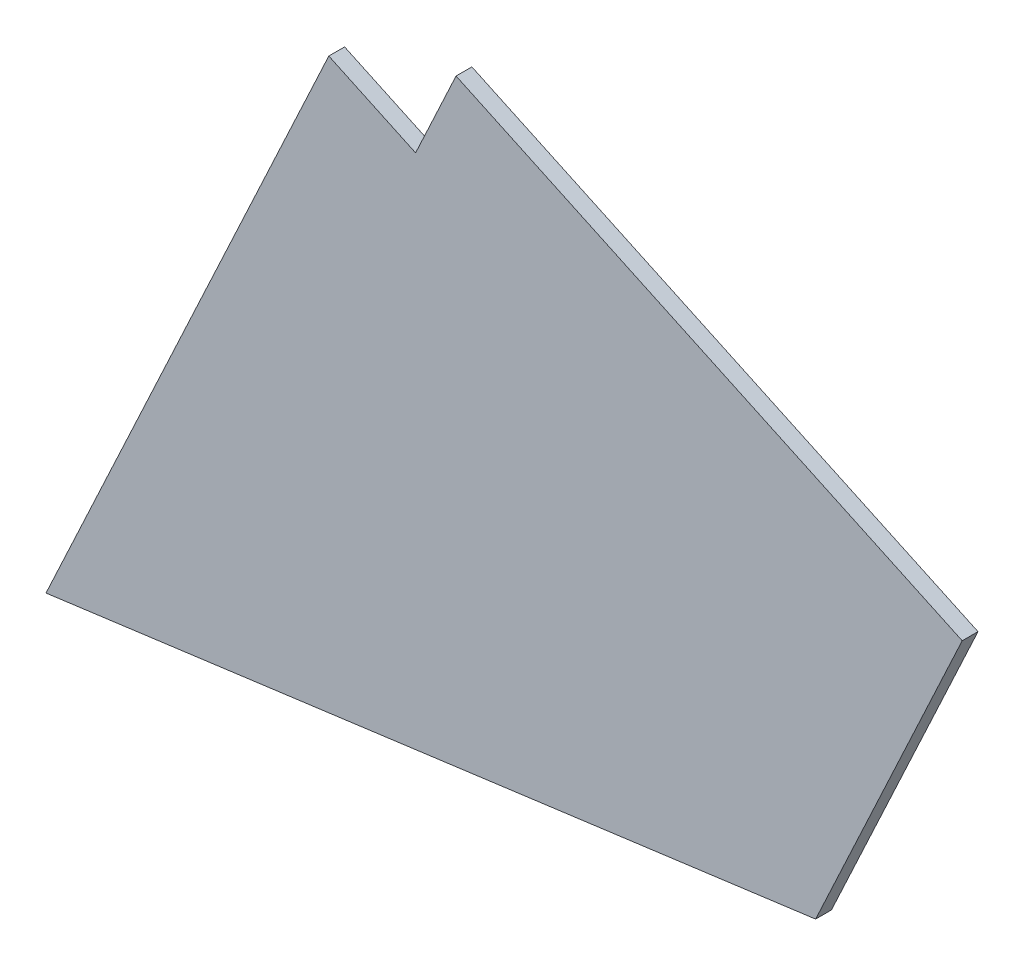
ISO-10303-21;
HEADER;
FILE_DESCRIPTION(('STEP AP214'),'2;1');
FILE_NAME('part.step','',(''),(''),'','','');
FILE_SCHEMA(('AUTOMOTIVE_DESIGN { 1 0 10303 214 1 1 1 1 }'));
ENDSEC;
DATA;
#1=APPLICATION_CONTEXT('core data for automotive mechanical design processes');
#2=APPLICATION_PROTOCOL_DEFINITION('international standard','automotive_design',2000,#1);
#3=PRODUCT_CONTEXT('',#1,'mechanical');
#4=PRODUCT('Part','Part','',(#3));
#5=PRODUCT_RELATED_PRODUCT_CATEGORY('part','',(#4));
#6=PRODUCT_DEFINITION_FORMATION('','',#4);
#7=PRODUCT_DEFINITION_CONTEXT('part definition',#1,'design');
#8=PRODUCT_DEFINITION('design','',#6,#7);
#9=PRODUCT_DEFINITION_SHAPE('','',#8);
#10=(LENGTH_UNIT() NAMED_UNIT(*) SI_UNIT(.MILLI.,.METRE.));
#11=(NAMED_UNIT(*) PLANE_ANGLE_UNIT() SI_UNIT($,.RADIAN.));
#12=(NAMED_UNIT(*) SI_UNIT($,.STERADIAN.) SOLID_ANGLE_UNIT());
#13=UNCERTAINTY_MEASURE_WITH_UNIT(LENGTH_MEASURE(1.E-05),#10,'distance_accuracy_value','');
#14=(GEOMETRIC_REPRESENTATION_CONTEXT(3) GLOBAL_UNCERTAINTY_ASSIGNED_CONTEXT((#13)) GLOBAL_UNIT_ASSIGNED_CONTEXT((#10,
#11,#12)) REPRESENTATION_CONTEXT('',''));
#15=CARTESIAN_POINT('',(0.,0.,0.));
#16=DIRECTION('',(0.,0.,1.));
#17=DIRECTION('',(1.,0.,0.));
#18=AXIS2_PLACEMENT_3D('',#15,#16,#17);
#19=CARTESIAN_POINT('',(-344.846056087077,-37.3320524751404,393.4));
#20=DIRECTION('',(-0.906307787036653,0.422618261740694,0.));
#21=DIRECTION('',(-0.422618261740694,-0.906307787036653,0.));
#22=AXIS2_PLACEMENT_3D('',#19,#20,#21);
#23=PLANE('',#22);
#24=DIRECTION('',(-0.422618261740694,-0.906307787036652,0.));
#25=VECTOR('',#24,1.);
#26=CARTESIAN_POINT('',(-344.846056087077,-37.3320524751404,396.7));
#27=LINE('',#26,#25);
#28=CARTESIAN_POINT('',(-285.777429853148,89.3410252685141,396.7));
#29=VERTEX_POINT('',#28);
#30=CARTESIAN_POINT('',(-344.846056087077,-37.3320524751404,396.7));
#31=VERTEX_POINT('',#30);
#32=EDGE_CURVE('E120',#29,#31,#27,.T.);
#33=ORIENTED_EDGE('',*,*,#32,.F.);
#34=DIRECTION('',(0.,0.,1.));
#35=VECTOR('',#34,1.);
#36=CARTESIAN_POINT('',(-285.777429853148,89.3410252685141,393.4));
#37=LINE('',#36,#35);
#38=CARTESIAN_POINT('',(-285.777429853148,89.3410252685141,393.4));
#39=VERTEX_POINT('',#38);
#40=EDGE_CURVE('E11',#39,#29,#37,.T.);
#41=ORIENTED_EDGE('',*,*,#40,.F.);
#42=DIRECTION('',(-0.422618261740694,-0.906307787036652,0.));
#43=VECTOR('',#42,1.);
#44=CARTESIAN_POINT('',(-344.846056087077,-37.3320524751404,393.4));
#45=LINE('',#44,#43);
#46=CARTESIAN_POINT('',(-344.846056087077,-37.3320524751404,393.4));
#47=VERTEX_POINT('',#46);
#48=EDGE_CURVE('E134',#39,#47,#45,.T.);
#49=ORIENTED_EDGE('',*,*,#48,.T.);
#50=DIRECTION('',(0.,0.,1.));
#51=VECTOR('',#50,1.);
#52=CARTESIAN_POINT('',(-344.846056087077,-37.3320524751404,393.4));
#53=LINE('',#52,#51);
#54=EDGE_CURVE('E38',#47,#31,#53,.T.);
#55=ORIENTED_EDGE('',*,*,#54,.T.);
#56=EDGE_LOOP('',(#33,#41,#49,#55));
#57=FACE_BOUND('',#56,.T.);
#58=ADVANCED_FACE('F35',(#57),#23,.T.);
#59=CARTESIAN_POINT('',(-285.777429853148,89.3410252685141,393.4));
#60=DIRECTION('',(0.422618261740694,0.906307787036652,0.));
#61=DIRECTION('',(-0.906307787036652,0.422618261740694,0.));
#62=AXIS2_PLACEMENT_3D('',#59,#60,#61);
#63=PLANE('',#62);
#64=DIRECTION('',(-0.906307787036652,0.422618261740694,0.));
#65=VECTOR('',#64,1.);
#66=CARTESIAN_POINT('',(-285.777429853148,89.3410252685141,396.7));
#67=LINE('',#66,#65);
#68=CARTESIAN_POINT('',(-267.651274112416,80.8886600337003,396.7));
#69=VERTEX_POINT('',#68);
#70=EDGE_CURVE('E132',#69,#29,#67,.T.);
#71=ORIENTED_EDGE('',*,*,#70,.F.);
#72=DIRECTION('',(0.,0.,1.));
#73=VECTOR('',#72,1.);
#74=CARTESIAN_POINT('',(-267.651274112416,80.8886600337003,393.4));
#75=LINE('',#74,#73);
#76=CARTESIAN_POINT('',(-267.651274112416,80.8886600337003,393.4));
#77=VERTEX_POINT('',#76);
#78=EDGE_CURVE('E44',#77,#69,#75,.T.);
#79=ORIENTED_EDGE('',*,*,#78,.F.);
#80=DIRECTION('',(-0.906307787036652,0.422618261740694,0.));
#81=VECTOR('',#80,1.);
#82=CARTESIAN_POINT('',(-285.777429853148,89.3410252685141,393.4));
#83=LINE('',#82,#81);
#84=EDGE_CURVE('E110',#77,#39,#83,.T.);
#85=ORIENTED_EDGE('',*,*,#84,.T.);
#86=ORIENTED_EDGE('',*,*,#40,.T.);
#87=EDGE_LOOP('',(#71,#79,#85,#86));
#88=FACE_BOUND('',#87,.T.);
#89=ADVANCED_FACE('F142',(#88),#63,.T.);
#90=CARTESIAN_POINT('',(-267.651274112416,80.8886600337003,393.4));
#91=DIRECTION('',(-0.906307787036652,0.422618261740694,0.));
#92=DIRECTION('',(-0.422618261740695,-0.906307787036652,0.));
#93=AXIS2_PLACEMENT_3D('',#90,#91,#92);
#94=PLANE('',#93);
#95=DIRECTION('',(-0.422618261740694,-0.906307787036652,0.));
#96=VECTOR('',#95,1.);
#97=CARTESIAN_POINT('',(-267.651274112416,80.8886600337003,396.7));
#98=LINE('',#97,#96);
#99=CARTESIAN_POINT('',(-259.198908877602,99.0148157744334,396.7));
#100=VERTEX_POINT('',#99);
#101=EDGE_CURVE('E97',#100,#69,#98,.T.);
#102=ORIENTED_EDGE('',*,*,#101,.F.);
#103=DIRECTION('',(0.,0.,1.));
#104=VECTOR('',#103,1.);
#105=CARTESIAN_POINT('',(-259.198908877602,99.0148157744334,393.4));
#106=LINE('',#105,#104);
#107=CARTESIAN_POINT('',(-259.198908877602,99.0148157744334,393.4));
#108=VERTEX_POINT('',#107);
#109=EDGE_CURVE('E92',#108,#100,#106,.T.);
#110=ORIENTED_EDGE('',*,*,#109,.F.);
#111=DIRECTION('',(-0.422618261740694,-0.906307787036652,0.));
#112=VECTOR('',#111,1.);
#113=CARTESIAN_POINT('',(-267.651274112416,80.8886600337003,393.4));
#114=LINE('',#113,#112);
#115=EDGE_CURVE('E95',#108,#77,#114,.T.);
#116=ORIENTED_EDGE('',*,*,#115,.T.);
#117=ORIENTED_EDGE('',*,*,#78,.T.);
#118=EDGE_LOOP('',(#102,#110,#116,#117));
#119=FACE_BOUND('',#118,.T.);
#120=ADVANCED_FACE('F94',(#119),#94,.T.);
#121=CARTESIAN_POINT('',(-259.198908877602,99.0148157744334,393.4));
#122=DIRECTION('',(0.422618261740694,0.906307787036653,0.));
#123=DIRECTION('',(-0.906307787036653,0.422618261740694,0.));
#124=AXIS2_PLACEMENT_3D('',#121,#122,#123);
#125=PLANE('',#124);
#126=DIRECTION('',(-0.906307787036653,0.422618261740694,0.));
#127=VECTOR('',#126,1.);
#128=CARTESIAN_POINT('',(-259.198908877602,99.0148157744334,396.7));
#129=LINE('',#128,#127);
#130=CARTESIAN_POINT('',(-153.48439283847,49.7193273672376,396.7));
#131=VERTEX_POINT('',#130);
#132=EDGE_CURVE('E129',#131,#100,#129,.T.);
#133=ORIENTED_EDGE('',*,*,#132,.F.);
#134=DIRECTION('',(0.,0.,1.));
#135=VECTOR('',#134,1.);
#136=CARTESIAN_POINT('',(-153.48439283847,49.7193273672376,393.4));
#137=LINE('',#136,#135);
#138=CARTESIAN_POINT('',(-153.48439283847,49.7193273672376,393.4));
#139=VERTEX_POINT('',#138);
#140=EDGE_CURVE('E102',#139,#131,#137,.T.);
#141=ORIENTED_EDGE('',*,*,#140,.F.);
#142=DIRECTION('',(-0.906307787036653,0.422618261740694,0.));
#143=VECTOR('',#142,1.);
#144=CARTESIAN_POINT('',(-259.198908877602,99.0148157744334,393.4));
#145=LINE('',#144,#143);
#146=EDGE_CURVE('E108',#139,#108,#145,.T.);
#147=ORIENTED_EDGE('',*,*,#146,.T.);
#148=ORIENTED_EDGE('',*,*,#109,.T.);
#149=EDGE_LOOP('',(#133,#141,#147,#148));
#150=FACE_BOUND('',#149,.T.);
#151=ADVANCED_FACE('F112',(#150),#125,.T.);
#152=CARTESIAN_POINT('',(-153.48439283847,49.7193273672376,393.4));
#153=DIRECTION('',(0.906307787036651,-0.422618261740696,0.));
#154=DIRECTION('',(0.422618261740696,0.906307787036651,0.));
#155=AXIS2_PLACEMENT_3D('',#152,#153,#154);
#156=PLANE('',#155);
#157=DIRECTION('',(0.422618261740696,0.906307787036651,0.));
#158=VECTOR('',#157,1.);
#159=CARTESIAN_POINT('',(-153.48439283847,49.7193273672376,396.7));
#160=LINE('',#159,#158);
#161=CARTESIAN_POINT('',(-184.10028402082,-15.9366631508804,396.7));
#162=VERTEX_POINT('',#161);
#163=EDGE_CURVE('E126',#162,#131,#160,.T.);
#164=ORIENTED_EDGE('',*,*,#163,.F.);
#165=DIRECTION('',(0.,0.,1.));
#166=VECTOR('',#165,1.);
#167=CARTESIAN_POINT('',(-184.10028402082,-15.9366631508804,393.4));
#168=LINE('',#167,#166);
#169=CARTESIAN_POINT('',(-184.10028402082,-15.9366631508804,393.4));
#170=VERTEX_POINT('',#169);
#171=EDGE_CURVE('E137',#170,#162,#168,.T.);
#172=ORIENTED_EDGE('',*,*,#171,.F.);
#173=DIRECTION('',(0.422618261740696,0.906307787036651,0.));
#174=VECTOR('',#173,1.);
#175=CARTESIAN_POINT('',(-153.48439283847,49.7193273672376,393.4));
#176=LINE('',#175,#174);
#177=EDGE_CURVE('E113',#170,#139,#176,.T.);
#178=ORIENTED_EDGE('',*,*,#177,.T.);
#179=ORIENTED_EDGE('',*,*,#140,.T.);
#180=EDGE_LOOP('',(#164,#172,#178,#179));
#181=FACE_BOUND('',#180,.T.);
#182=ADVANCED_FACE('F155',(#181),#156,.T.);
#183=CARTESIAN_POINT('',(-344.846056087077,-37.3320524751404,393.4));
#184=DIRECTION('',(0.131937233011008,-0.99125807262559,0.));
#185=DIRECTION('',(0.99125807262559,0.131937233011008,0.));
#186=AXIS2_PLACEMENT_3D('',#183,#184,#185);
#187=PLANE('',#186);
#188=DIRECTION('',(0.99125807262559,0.131937233011008,0.));
#189=VECTOR('',#188,1.);
#190=CARTESIAN_POINT('',(-344.846056087077,-37.3320524751404,396.7));
#191=LINE('',#190,#189);
#192=EDGE_CURVE('E123',#31,#162,#191,.T.);
#193=ORIENTED_EDGE('',*,*,#192,.F.);
#194=ORIENTED_EDGE('',*,*,#54,.F.);
#195=DIRECTION('',(0.99125807262559,0.131937233011008,0.));
#196=VECTOR('',#195,1.);
#197=CARTESIAN_POINT('',(-344.846056087077,-37.3320524751404,393.4));
#198=LINE('',#197,#196);
#199=EDGE_CURVE('E115',#47,#170,#198,.T.);
#200=ORIENTED_EDGE('',*,*,#199,.T.);
#201=ORIENTED_EDGE('',*,*,#171,.T.);
#202=EDGE_LOOP('',(#193,#194,#200,#201));
#203=FACE_BOUND('',#202,.T.);
#204=ADVANCED_FACE('F139',(#203),#187,.T.);
#205=CARTESIAN_POINT('',(0.,0.,393.4));
#206=DIRECTION('',(0.,0.,-1.));
#207=DIRECTION('',(-1.,0.,0.));
#208=AXIS2_PLACEMENT_3D('',#205,#206,#207);
#209=PLANE('',#208);
#210=ORIENTED_EDGE('',*,*,#48,.F.);
#211=ORIENTED_EDGE('',*,*,#84,.F.);
#212=ORIENTED_EDGE('',*,*,#115,.F.);
#213=ORIENTED_EDGE('',*,*,#146,.F.);
#214=ORIENTED_EDGE('',*,*,#177,.F.);
#215=ORIENTED_EDGE('',*,*,#199,.F.);
#216=EDGE_LOOP('',(#210,#211,#212,#213,#214,#215));
#217=FACE_BOUND('',#216,.T.);
#218=ADVANCED_FACE('F106',(#217),#209,.T.);
#219=CARTESIAN_POINT('',(0.,0.,396.7));
#220=DIRECTION('',(0.,0.,-1.));
#221=DIRECTION('',(-1.,0.,0.));
#222=AXIS2_PLACEMENT_3D('',#219,#220,#221);
#223=PLANE('',#222);
#224=ORIENTED_EDGE('',*,*,#32,.T.);
#225=ORIENTED_EDGE('',*,*,#192,.T.);
#226=ORIENTED_EDGE('',*,*,#163,.T.);
#227=ORIENTED_EDGE('',*,*,#132,.T.);
#228=ORIENTED_EDGE('',*,*,#101,.T.);
#229=ORIENTED_EDGE('',*,*,#70,.T.);
#230=EDGE_LOOP('',(#224,#225,#226,#227,#228,#229));
#231=FACE_BOUND('',#230,.T.);
#232=ADVANCED_FACE('F141',(#231),#223,.F.);
#233=CLOSED_SHELL('',(#58,#89,#120,#151,#182,#204,#218,#232));
#234=MANIFOLD_SOLID_BREP('B2',#233);
#235=ADVANCED_BREP_SHAPE_REPRESENTATION('',(#18,#234),#14);
#236=SHAPE_DEFINITION_REPRESENTATION(#9,#235);
ENDSEC;
END-ISO-10303-21;
